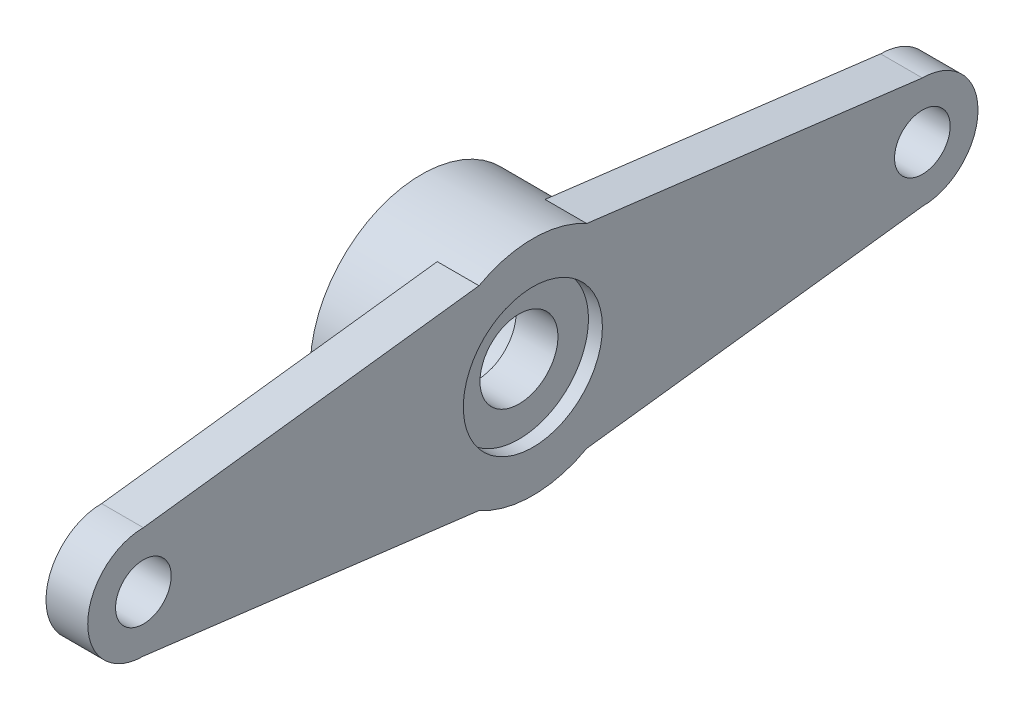
ISO-10303-21;
HEADER;
FILE_DESCRIPTION(('STEP AP214'),'2;1');
FILE_NAME('part.step','',(''),(''),'','','');
FILE_SCHEMA(('AUTOMOTIVE_DESIGN { 1 0 10303 214 1 1 1 1 }'));
ENDSEC;
DATA;
#1=APPLICATION_CONTEXT('core data for automotive mechanical design processes');
#2=APPLICATION_PROTOCOL_DEFINITION('international standard','automotive_design',2000,#1);
#3=PRODUCT_CONTEXT('',#1,'mechanical');
#4=PRODUCT('Part','Part','',(#3));
#5=PRODUCT_RELATED_PRODUCT_CATEGORY('part','',(#4));
#6=PRODUCT_DEFINITION_FORMATION('','',#4);
#7=PRODUCT_DEFINITION_CONTEXT('part definition',#1,'design');
#8=PRODUCT_DEFINITION('design','',#6,#7);
#9=PRODUCT_DEFINITION_SHAPE('','',#8);
#10=(LENGTH_UNIT() NAMED_UNIT(*) SI_UNIT(.MILLI.,.METRE.));
#11=(NAMED_UNIT(*) PLANE_ANGLE_UNIT() SI_UNIT($,.RADIAN.));
#12=(NAMED_UNIT(*) SI_UNIT($,.STERADIAN.) SOLID_ANGLE_UNIT());
#13=UNCERTAINTY_MEASURE_WITH_UNIT(LENGTH_MEASURE(1.E-05),#10,'distance_accuracy_value','');
#14=(GEOMETRIC_REPRESENTATION_CONTEXT(3) GLOBAL_UNCERTAINTY_ASSIGNED_CONTEXT((#13)) GLOBAL_UNIT_ASSIGNED_CONTEXT((#10,
#11,#12)) REPRESENTATION_CONTEXT('',''));
#15=CARTESIAN_POINT('',(0.,0.,0.));
#16=DIRECTION('',(0.,0.,1.));
#17=DIRECTION('',(1.,0.,0.));
#18=AXIS2_PLACEMENT_3D('',#15,#16,#17);
#19=CARTESIAN_POINT('',(3.5,0.,0.));
#20=DIRECTION('',(-1.,0.,0.));
#21=DIRECTION('',(0.,0.,1.));
#22=AXIS2_PLACEMENT_3D('',#19,#20,#21);
#23=CYLINDRICAL_SURFACE('',#22,2.5);
#24=CARTESIAN_POINT('',(3.5,0.,0.));
#25=DIRECTION('',(-1.,0.,0.));
#26=DIRECTION('',(0.,0.,1.));
#27=AXIS2_PLACEMENT_3D('',#24,#25,#26);
#28=CIRCLE('',#27,2.5);
#29=CARTESIAN_POINT('',(3.5,0.,2.5));
#30=VERTEX_POINT('',#29);
#31=EDGE_CURVE('E11',#30,#30,#28,.T.);
#32=ORIENTED_EDGE('',*,*,#31,.T.);
#33=EDGE_LOOP('',(#32));
#34=FACE_BOUND('',#33,.T.);
#35=CARTESIAN_POINT('',(2.,0.,0.));
#36=DIRECTION('',(-1.,0.,0.));
#37=DIRECTION('',(0.,0.,1.));
#38=AXIS2_PLACEMENT_3D('',#35,#36,#37);
#39=CIRCLE('',#38,2.5);
#40=CARTESIAN_POINT('',(2.,0.,2.5));
#41=VERTEX_POINT('',#40);
#42=EDGE_CURVE('E54',#41,#41,#39,.T.);
#43=ORIENTED_EDGE('',*,*,#42,.F.);
#44=EDGE_LOOP('',(#43));
#45=FACE_BOUND('',#44,.T.);
#46=ADVANCED_FACE('F41',(#34,#45),#23,.T.);
#47=CARTESIAN_POINT('',(3.5,0.,0.));
#48=DIRECTION('',(-1.,0.,0.));
#49=DIRECTION('',(0.,0.,1.));
#50=AXIS2_PLACEMENT_3D('',#47,#48,#49);
#51=CYLINDRICAL_SURFACE('',#50,1.40092198796597);
#52=CARTESIAN_POINT('',(3.5,0.,0.));
#53=DIRECTION('',(-1.,0.,0.));
#54=DIRECTION('',(0.,0.,1.));
#55=AXIS2_PLACEMENT_3D('',#52,#53,#54);
#56=CIRCLE('',#55,1.40092198796597);
#57=CARTESIAN_POINT('',(3.5,0.,1.40092198796597));
#58=VERTEX_POINT('',#57);
#59=EDGE_CURVE('E48',#58,#58,#56,.T.);
#60=ORIENTED_EDGE('',*,*,#59,.F.);
#61=EDGE_LOOP('',(#60));
#62=FACE_BOUND('',#61,.T.);
#63=CARTESIAN_POINT('',(2.,0.,0.));
#64=DIRECTION('',(-1.,0.,0.));
#65=DIRECTION('',(0.,0.,1.));
#66=AXIS2_PLACEMENT_3D('',#63,#64,#65);
#67=CIRCLE('',#66,1.40092198796597);
#68=CARTESIAN_POINT('',(2.,0.,1.40092198796597));
#69=VERTEX_POINT('',#68);
#70=EDGE_CURVE('E44',#69,#69,#67,.F.);
#71=ORIENTED_EDGE('',*,*,#70,.F.);
#72=EDGE_LOOP('',(#71));
#73=FACE_BOUND('',#72,.T.);
#74=ADVANCED_FACE('F63',(#62,#73),#51,.F.);
#75=CARTESIAN_POINT('',(3.5,0.,0.));
#76=DIRECTION('',(-1.,0.,0.));
#77=DIRECTION('',(0.,0.,1.));
#78=AXIS2_PLACEMENT_3D('',#75,#76,#77);
#79=PLANE('',#78);
#80=ORIENTED_EDGE('',*,*,#59,.T.);
#81=EDGE_LOOP('',(#80));
#82=FACE_BOUND('',#81,.T.);
#83=ORIENTED_EDGE('',*,*,#31,.F.);
#84=EDGE_LOOP('',(#83));
#85=FACE_BOUND('',#84,.T.);
#86=ADVANCED_FACE('F65',(#82,#85),#79,.F.);
#87=CARTESIAN_POINT('',(2.,0.,0.));
#88=DIRECTION('',(-1.,0.,0.));
#89=DIRECTION('',(0.,0.,1.));
#90=AXIS2_PLACEMENT_3D('',#87,#88,#89);
#91=PLANE('',#90);
#92=ORIENTED_EDGE('',*,*,#42,.T.);
#93=EDGE_LOOP('',(#92));
#94=FACE_BOUND('',#93,.T.);
#95=ORIENTED_EDGE('',*,*,#70,.T.);
#96=EDGE_LOOP('',(#95));
#97=FACE_BOUND('',#96,.T.);
#98=ADVANCED_FACE('F61',(#94,#97),#91,.T.);
#99=CLOSED_SHELL('',(#46,#74,#86,#98));
#100=MANIFOLD_SOLID_BREP('B2',#99);
#101=CARTESIAN_POINT('',(0.,0.,0.));
#102=DIRECTION('',(1.,0.,0.));
#103=DIRECTION('',(0.,0.,-1.));
#104=AXIS2_PLACEMENT_3D('',#101,#102,#103);
#105=PLANE('',#104);
#106=CARTESIAN_POINT('',(0.,0.,0.));
#107=DIRECTION('',(1.,0.,0.));
#108=DIRECTION('',(0.,0.,-1.));
#109=AXIS2_PLACEMENT_3D('',#106,#107,#108);
#110=CIRCLE('',#109,4.);
#111=CARTESIAN_POINT('',(0.,0.,-4.));
#112=VERTEX_POINT('',#111);
#113=EDGE_CURVE('E107',#112,#112,#110,.T.);
#114=ORIENTED_EDGE('',*,*,#113,.F.);
#115=EDGE_LOOP('',(#114));
#116=FACE_BOUND('',#115,.T.);
#117=CARTESIAN_POINT('',(0.,0.,0.));
#118=DIRECTION('',(1.,0.,0.));
#119=DIRECTION('',(0.,0.,-1.));
#120=AXIS2_PLACEMENT_3D('',#117,#118,#119);
#121=CIRCLE('',#120,2.5);
#122=CARTESIAN_POINT('',(0.,0.,-2.5));
#123=VERTEX_POINT('',#122);
#124=EDGE_CURVE('E189',#123,#123,#121,.T.);
#125=ORIENTED_EDGE('',*,*,#124,.T.);
#126=EDGE_LOOP('',(#125));
#127=FACE_BOUND('',#126,.T.);
#128=ADVANCED_FACE('F103',(#116,#127),#105,.F.);
#129=CARTESIAN_POINT('',(2.5,0.,0.));
#130=DIRECTION('',(-1.,0.,0.));
#131=DIRECTION('',(0.,0.,1.));
#132=AXIS2_PLACEMENT_3D('',#129,#130,#131);
#133=CYLINDRICAL_SURFACE('',#132,4.);
#134=CARTESIAN_POINT('',(2.5,0.,0.));
#135=DIRECTION('',(1.,0.,0.));
#136=DIRECTION('',(0.,0.,-1.));
#137=AXIS2_PLACEMENT_3D('',#134,#135,#136);
#138=CIRCLE('',#137,4.);
#139=CARTESIAN_POINT('',(2.5,3.5,1.93649167310372));
#140=VERTEX_POINT('',#139);
#141=CARTESIAN_POINT('',(2.5,-3.5,1.9364916731037));
#142=VERTEX_POINT('',#141);
#143=EDGE_CURVE('E39',#140,#142,#138,.T.);
#144=ORIENTED_EDGE('',*,*,#143,.F.);
#145=DIRECTION('',(-1.,0.,0.));
#146=VECTOR('',#145,1.);
#147=CARTESIAN_POINT('',(4.,3.5,1.93649167310371));
#148=LINE('',#147,#146);
#149=CARTESIAN_POINT('',(4.,3.5,1.93649167310371));
#150=VERTEX_POINT('',#149);
#151=EDGE_CURVE('E257',#150,#140,#148,.T.);
#152=ORIENTED_EDGE('',*,*,#151,.F.);
#153=CARTESIAN_POINT('',(4.,0.,0.));
#154=DIRECTION('',(1.,0.,0.));
#155=DIRECTION('',(0.,0.,-1.));
#156=AXIS2_PLACEMENT_3D('',#153,#154,#155);
#157=CIRCLE('',#156,4.);
#158=CARTESIAN_POINT('',(4.,3.5,-1.93649167310371));
#159=VERTEX_POINT('',#158);
#160=EDGE_CURVE('E232',#159,#150,#157,.T.);
#161=ORIENTED_EDGE('',*,*,#160,.F.);
#162=DIRECTION('',(-1.,0.,0.));
#163=VECTOR('',#162,1.);
#164=CARTESIAN_POINT('',(4.,3.5,-1.93649167310371));
#165=LINE('',#164,#163);
#166=CARTESIAN_POINT('',(2.5,3.5,-1.93649167310371));
#167=VERTEX_POINT('',#166);
#168=EDGE_CURVE('E260',#159,#167,#165,.T.);
#169=ORIENTED_EDGE('',*,*,#168,.T.);
#170=CARTESIAN_POINT('',(2.5,-3.5,-1.9364916731037));
#171=VERTEX_POINT('',#170);
#172=EDGE_CURVE('E112',#171,#167,#138,.T.);
#173=ORIENTED_EDGE('',*,*,#172,.F.);
#174=DIRECTION('',(-1.,0.,0.));
#175=VECTOR('',#174,1.);
#176=CARTESIAN_POINT('',(4.,-3.5,-1.9364916731037));
#177=LINE('',#176,#175);
#178=CARTESIAN_POINT('',(4.,-3.5,-1.9364916731037));
#179=VERTEX_POINT('',#178);
#180=EDGE_CURVE('E171',#179,#171,#177,.T.);
#181=ORIENTED_EDGE('',*,*,#180,.F.);
#182=CARTESIAN_POINT('',(4.,0.,0.));
#183=DIRECTION('',(1.,0.,0.));
#184=DIRECTION('',(0.,0.,-1.));
#185=AXIS2_PLACEMENT_3D('',#182,#183,#184);
#186=CIRCLE('',#185,4.);
#187=CARTESIAN_POINT('',(4.,-3.5,1.9364916731037));
#188=VERTEX_POINT('',#187);
#189=EDGE_CURVE('E177',#188,#179,#186,.T.);
#190=ORIENTED_EDGE('',*,*,#189,.F.);
#191=DIRECTION('',(-1.,0.,0.));
#192=VECTOR('',#191,1.);
#193=CARTESIAN_POINT('',(4.,-3.5,1.9364916731037));
#194=LINE('',#193,#192);
#195=EDGE_CURVE('E239',#188,#142,#194,.T.);
#196=ORIENTED_EDGE('',*,*,#195,.T.);
#197=EDGE_LOOP('',(#144,#152,#161,#169,#173,#181,#190,#196));
#198=FACE_BOUND('',#197,.T.);
#199=ORIENTED_EDGE('',*,*,#113,.T.);
#200=EDGE_LOOP('',(#199));
#201=FACE_BOUND('',#200,.T.);
#202=ADVANCED_FACE('F105',(#198,#201),#133,.T.);
#203=CARTESIAN_POINT('',(2.5,0.,0.));
#204=DIRECTION('',(-1.,0.,0.));
#205=DIRECTION('',(0.,0.,1.));
#206=AXIS2_PLACEMENT_3D('',#203,#204,#205);
#207=CYLINDRICAL_SURFACE('',#206,2.5);
#208=ORIENTED_EDGE('',*,*,#124,.F.);
#209=EDGE_LOOP('',(#208));
#210=FACE_BOUND('',#209,.T.);
#211=CARTESIAN_POINT('',(4.,0.,0.));
#212=DIRECTION('',(1.,0.,0.));
#213=DIRECTION('',(0.,0.,-1.));
#214=AXIS2_PLACEMENT_3D('',#211,#212,#213);
#215=CIRCLE('',#214,2.5);
#216=CARTESIAN_POINT('',(4.,0.,-2.5));
#217=VERTEX_POINT('',#216);
#218=EDGE_CURVE('E213',#217,#217,#215,.T.);
#219=ORIENTED_EDGE('',*,*,#218,.T.);
#220=EDGE_LOOP('',(#219));
#221=FACE_BOUND('',#220,.T.);
#222=ADVANCED_FACE('F206',(#210,#221),#207,.F.);
#223=CARTESIAN_POINT('',(2.5,0.,0.));
#224=DIRECTION('',(1.,0.,0.));
#225=DIRECTION('',(0.,0.,-1.));
#226=AXIS2_PLACEMENT_3D('',#223,#224,#225);
#227=PLANE('',#226);
#228=CARTESIAN_POINT('',(2.5,0.,14.));
#229=DIRECTION('',(1.,0.,0.));
#230=DIRECTION('',(0.,0.,-1.));
#231=AXIS2_PLACEMENT_3D('',#228,#229,#230);
#232=CIRCLE('',#231,1.);
#233=CARTESIAN_POINT('',(2.5,0.,13.));
#234=VERTEX_POINT('',#233);
#235=EDGE_CURVE('E222',#234,#234,#232,.T.);
#236=ORIENTED_EDGE('',*,*,#235,.T.);
#237=EDGE_LOOP('',(#236));
#238=FACE_BOUND('',#237,.T.);
#239=DIRECTION('',(0.,-0.123391721734239,0.992358041740712));
#240=VECTOR('',#239,1.);
#241=CARTESIAN_POINT('',(2.5,2.,14.));
#242=LINE('',#241,#240);
#243=CARTESIAN_POINT('',(2.5,2.,14.));
#244=VERTEX_POINT('',#243);
#245=EDGE_CURVE('E245',#140,#244,#242,.T.);
#246=ORIENTED_EDGE('',*,*,#245,.F.);
#247=ORIENTED_EDGE('',*,*,#143,.T.);
#248=DIRECTION('',(0.,-0.12339172173424,-0.992358041740712));
#249=VECTOR('',#248,1.);
#250=CARTESIAN_POINT('',(2.5,-3.5,1.9364916731037));
#251=LINE('',#250,#249);
#252=CARTESIAN_POINT('',(2.5,-2.,14.));
#253=VERTEX_POINT('',#252);
#254=EDGE_CURVE('E186',#253,#142,#251,.T.);
#255=ORIENTED_EDGE('',*,*,#254,.F.);
#256=CARTESIAN_POINT('',(2.5,0.,14.));
#257=DIRECTION('',(1.,0.,0.));
#258=DIRECTION('',(0.,0.,-1.));
#259=AXIS2_PLACEMENT_3D('',#256,#257,#258);
#260=CIRCLE('',#259,2.);
#261=EDGE_CURVE('E247',#244,#253,#260,.T.);
#262=ORIENTED_EDGE('',*,*,#261,.F.);
#263=EDGE_LOOP('',(#246,#247,#255,#262));
#264=FACE_BOUND('',#263,.T.);
#265=ADVANCED_FACE('F209',(#238,#264),#227,.F.);
#266=CARTESIAN_POINT('',(2.5,0.,-14.));
#267=DIRECTION('',(1.,0.,0.));
#268=DIRECTION('',(0.,0.,-1.));
#269=AXIS2_PLACEMENT_3D('',#266,#267,#268);
#270=CIRCLE('',#269,1.);
#271=CARTESIAN_POINT('',(2.5,0.,-15.));
#272=VERTEX_POINT('',#271);
#273=EDGE_CURVE('E215',#272,#272,#270,.T.);
#274=ORIENTED_EDGE('',*,*,#273,.T.);
#275=EDGE_LOOP('',(#274));
#276=FACE_BOUND('',#275,.T.);
#277=DIRECTION('',(0.,0.12339172173424,-0.992358041740712));
#278=VECTOR('',#277,1.);
#279=CARTESIAN_POINT('',(2.5,-2.,-14.));
#280=LINE('',#279,#278);
#281=CARTESIAN_POINT('',(2.5,-2.,-14.));
#282=VERTEX_POINT('',#281);
#283=EDGE_CURVE('E227',#171,#282,#280,.T.);
#284=ORIENTED_EDGE('',*,*,#283,.F.);
#285=ORIENTED_EDGE('',*,*,#172,.T.);
#286=DIRECTION('',(0.,0.123391721734239,0.992358041740712));
#287=VECTOR('',#286,1.);
#288=CARTESIAN_POINT('',(2.5,2.,-14.));
#289=LINE('',#288,#287);
#290=CARTESIAN_POINT('',(2.5,2.,-14.));
#291=VERTEX_POINT('',#290);
#292=EDGE_CURVE('E243',#291,#167,#289,.T.);
#293=ORIENTED_EDGE('',*,*,#292,.F.);
#294=CARTESIAN_POINT('',(2.5,0.,-14.));
#295=DIRECTION('',(1.,0.,0.));
#296=DIRECTION('',(0.,0.,-1.));
#297=AXIS2_PLACEMENT_3D('',#294,#295,#296);
#298=CIRCLE('',#297,2.);
#299=EDGE_CURVE('E241',#282,#291,#298,.T.);
#300=ORIENTED_EDGE('',*,*,#299,.F.);
#301=EDGE_LOOP('',(#284,#285,#293,#300));
#302=FACE_BOUND('',#301,.T.);
#303=ADVANCED_FACE('F269',(#276,#302),#227,.F.);
#304=CARTESIAN_POINT('',(4.,0.,0.));
#305=DIRECTION('',(1.,0.,0.));
#306=DIRECTION('',(0.,0.,-1.));
#307=AXIS2_PLACEMENT_3D('',#304,#305,#306);
#308=PLANE('',#307);
#309=ORIENTED_EDGE('',*,*,#218,.F.);
#310=EDGE_LOOP('',(#309));
#311=FACE_BOUND('',#310,.T.);
#312=ORIENTED_EDGE('',*,*,#189,.T.);
#313=DIRECTION('',(0.,0.12339172173424,-0.992358041740712));
#314=VECTOR('',#313,1.);
#315=CARTESIAN_POINT('',(4.,-2.,-14.));
#316=LINE('',#315,#314);
#317=CARTESIAN_POINT('',(4.,-2.,-14.));
#318=VERTEX_POINT('',#317);
#319=EDGE_CURVE('E168',#179,#318,#316,.T.);
#320=ORIENTED_EDGE('',*,*,#319,.T.);
#321=CARTESIAN_POINT('',(4.,0.,-14.));
#322=DIRECTION('',(1.,0.,0.));
#323=DIRECTION('',(0.,0.,-1.));
#324=AXIS2_PLACEMENT_3D('',#321,#322,#323);
#325=CIRCLE('',#324,2.);
#326=CARTESIAN_POINT('',(4.,2.,-14.));
#327=VERTEX_POINT('',#326);
#328=EDGE_CURVE('E176',#318,#327,#325,.T.);
#329=ORIENTED_EDGE('',*,*,#328,.T.);
#330=DIRECTION('',(0.,0.123391721734239,0.992358041740712));
#331=VECTOR('',#330,1.);
#332=CARTESIAN_POINT('',(4.,2.,-14.));
#333=LINE('',#332,#331);
#334=EDGE_CURVE('E230',#327,#159,#333,.T.);
#335=ORIENTED_EDGE('',*,*,#334,.T.);
#336=ORIENTED_EDGE('',*,*,#160,.T.);
#337=DIRECTION('',(0.,-0.123391721734239,0.992358041740712));
#338=VECTOR('',#337,1.);
#339=CARTESIAN_POINT('',(4.,2.,14.));
#340=LINE('',#339,#338);
#341=CARTESIAN_POINT('',(4.,2.,14.));
#342=VERTEX_POINT('',#341);
#343=EDGE_CURVE('E234',#150,#342,#340,.T.);
#344=ORIENTED_EDGE('',*,*,#343,.T.);
#345=CARTESIAN_POINT('',(4.,0.,14.));
#346=DIRECTION('',(1.,0.,0.));
#347=DIRECTION('',(0.,0.,-1.));
#348=AXIS2_PLACEMENT_3D('',#345,#346,#347);
#349=CIRCLE('',#348,2.);
#350=CARTESIAN_POINT('',(4.,-2.,14.));
#351=VERTEX_POINT('',#350);
#352=EDGE_CURVE('E236',#342,#351,#349,.T.);
#353=ORIENTED_EDGE('',*,*,#352,.T.);
#354=DIRECTION('',(0.,-0.12339172173424,-0.992358041740712));
#355=VECTOR('',#354,1.);
#356=CARTESIAN_POINT('',(4.,-3.5,1.9364916731037));
#357=LINE('',#356,#355);
#358=EDGE_CURVE('E183',#351,#188,#357,.T.);
#359=ORIENTED_EDGE('',*,*,#358,.T.);
#360=EDGE_LOOP('',(#312,#320,#329,#335,#336,#344,#353,#359));
#361=FACE_BOUND('',#360,.T.);
#362=CARTESIAN_POINT('',(4.,0.,-14.));
#363=DIRECTION('',(1.,0.,0.));
#364=DIRECTION('',(0.,0.,-1.));
#365=AXIS2_PLACEMENT_3D('',#362,#363,#364);
#366=CIRCLE('',#365,1.);
#367=CARTESIAN_POINT('',(4.,0.,-15.));
#368=VERTEX_POINT('',#367);
#369=EDGE_CURVE('E219',#368,#368,#366,.T.);
#370=ORIENTED_EDGE('',*,*,#369,.F.);
#371=EDGE_LOOP('',(#370));
#372=FACE_BOUND('',#371,.T.);
#373=CARTESIAN_POINT('',(4.,0.,14.));
#374=DIRECTION('',(1.,0.,0.));
#375=DIRECTION('',(0.,0.,-1.));
#376=AXIS2_PLACEMENT_3D('',#373,#374,#375);
#377=CIRCLE('',#376,1.);
#378=CARTESIAN_POINT('',(4.,0.,13.));
#379=VERTEX_POINT('',#378);
#380=EDGE_CURVE('E216',#379,#379,#377,.T.);
#381=ORIENTED_EDGE('',*,*,#380,.F.);
#382=EDGE_LOOP('',(#381));
#383=FACE_BOUND('',#382,.T.);
#384=ADVANCED_FACE('F180',(#311,#361,#372,#383),#308,.T.);
#385=CARTESIAN_POINT('',(4.,-2.,-14.));
#386=DIRECTION('',(0.,0.992358041740712,0.12339172173424));
#387=DIRECTION('',(0.,-0.12339172173424,0.992358041740712));
#388=AXIS2_PLACEMENT_3D('',#385,#386,#387);
#389=PLANE('',#388);
#390=ORIENTED_EDGE('',*,*,#283,.T.);
#391=DIRECTION('',(-1.,0.,0.));
#392=VECTOR('',#391,1.);
#393=CARTESIAN_POINT('',(4.,-2.,-14.));
#394=LINE('',#393,#392);
#395=EDGE_CURVE('E173',#318,#282,#394,.T.);
#396=ORIENTED_EDGE('',*,*,#395,.F.);
#397=ORIENTED_EDGE('',*,*,#319,.F.);
#398=ORIENTED_EDGE('',*,*,#180,.T.);
#399=EDGE_LOOP('',(#390,#396,#397,#398));
#400=FACE_BOUND('',#399,.T.);
#401=ADVANCED_FACE('F170',(#400),#389,.F.);
#402=CARTESIAN_POINT('',(4.,0.,-14.));
#403=DIRECTION('',(-1.,0.,0.));
#404=DIRECTION('',(0.,0.,1.));
#405=AXIS2_PLACEMENT_3D('',#402,#403,#404);
#406=CYLINDRICAL_SURFACE('',#405,2.);
#407=ORIENTED_EDGE('',*,*,#299,.T.);
#408=DIRECTION('',(-1.,0.,0.));
#409=VECTOR('',#408,1.);
#410=CARTESIAN_POINT('',(4.,2.,-14.));
#411=LINE('',#410,#409);
#412=EDGE_CURVE('E193',#327,#291,#411,.T.);
#413=ORIENTED_EDGE('',*,*,#412,.F.);
#414=ORIENTED_EDGE('',*,*,#328,.F.);
#415=ORIENTED_EDGE('',*,*,#395,.T.);
#416=EDGE_LOOP('',(#407,#413,#414,#415));
#417=FACE_BOUND('',#416,.T.);
#418=ADVANCED_FACE('F270',(#417),#406,.T.);
#419=CARTESIAN_POINT('',(4.,2.,-14.));
#420=DIRECTION('',(0.,-0.992358041740712,0.123391721734239));
#421=DIRECTION('',(0.,-0.123391721734239,-0.992358041740712));
#422=AXIS2_PLACEMENT_3D('',#419,#420,#421);
#423=PLANE('',#422);
#424=ORIENTED_EDGE('',*,*,#292,.T.);
#425=ORIENTED_EDGE('',*,*,#168,.F.);
#426=ORIENTED_EDGE('',*,*,#334,.F.);
#427=ORIENTED_EDGE('',*,*,#412,.T.);
#428=EDGE_LOOP('',(#424,#425,#426,#427));
#429=FACE_BOUND('',#428,.T.);
#430=ADVANCED_FACE('F265',(#429),#423,.F.);
#431=CARTESIAN_POINT('',(4.,2.,14.));
#432=DIRECTION('',(0.,-0.992358041740712,-0.123391721734239));
#433=DIRECTION('',(0.,0.123391721734239,-0.992358041740712));
#434=AXIS2_PLACEMENT_3D('',#431,#432,#433);
#435=PLANE('',#434);
#436=ORIENTED_EDGE('',*,*,#245,.T.);
#437=DIRECTION('',(-1.,0.,0.));
#438=VECTOR('',#437,1.);
#439=CARTESIAN_POINT('',(4.,2.,14.));
#440=LINE('',#439,#438);
#441=EDGE_CURVE('E254',#342,#244,#440,.T.);
#442=ORIENTED_EDGE('',*,*,#441,.F.);
#443=ORIENTED_EDGE('',*,*,#343,.F.);
#444=ORIENTED_EDGE('',*,*,#151,.T.);
#445=EDGE_LOOP('',(#436,#442,#443,#444));
#446=FACE_BOUND('',#445,.T.);
#447=ADVANCED_FACE('F276',(#446),#435,.F.);
#448=CARTESIAN_POINT('',(4.,0.,14.));
#449=DIRECTION('',(-1.,0.,0.));
#450=DIRECTION('',(0.,0.,1.));
#451=AXIS2_PLACEMENT_3D('',#448,#449,#450);
#452=CYLINDRICAL_SURFACE('',#451,2.);
#453=ORIENTED_EDGE('',*,*,#261,.T.);
#454=DIRECTION('',(-1.,0.,0.));
#455=VECTOR('',#454,1.);
#456=CARTESIAN_POINT('',(4.,-2.,14.));
#457=LINE('',#456,#455);
#458=EDGE_CURVE('E251',#351,#253,#457,.T.);
#459=ORIENTED_EDGE('',*,*,#458,.F.);
#460=ORIENTED_EDGE('',*,*,#352,.F.);
#461=ORIENTED_EDGE('',*,*,#441,.T.);
#462=EDGE_LOOP('',(#453,#459,#460,#461));
#463=FACE_BOUND('',#462,.T.);
#464=ADVANCED_FACE('F280',(#463),#452,.T.);
#465=CARTESIAN_POINT('',(4.,-3.5,1.9364916731037));
#466=DIRECTION('',(0.,0.992358041740712,-0.12339172173424));
#467=DIRECTION('',(0.,0.12339172173424,0.992358041740712));
#468=AXIS2_PLACEMENT_3D('',#465,#466,#467);
#469=PLANE('',#468);
#470=ORIENTED_EDGE('',*,*,#254,.T.);
#471=ORIENTED_EDGE('',*,*,#195,.F.);
#472=ORIENTED_EDGE('',*,*,#358,.F.);
#473=ORIENTED_EDGE('',*,*,#458,.T.);
#474=EDGE_LOOP('',(#470,#471,#472,#473));
#475=FACE_BOUND('',#474,.T.);
#476=ADVANCED_FACE('F283',(#475),#469,.F.);
#477=CARTESIAN_POINT('',(4.,0.,-14.));
#478=DIRECTION('',(-1.,0.,0.));
#479=DIRECTION('',(0.,0.,1.));
#480=AXIS2_PLACEMENT_3D('',#477,#478,#479);
#481=CYLINDRICAL_SURFACE('',#480,1.);
#482=ORIENTED_EDGE('',*,*,#369,.T.);
#483=EDGE_LOOP('',(#482));
#484=FACE_BOUND('',#483,.T.);
#485=ORIENTED_EDGE('',*,*,#273,.F.);
#486=EDGE_LOOP('',(#485));
#487=FACE_BOUND('',#486,.T.);
#488=ADVANCED_FACE('F297',(#484,#487),#481,.F.);
#489=CARTESIAN_POINT('',(4.,0.,14.));
#490=DIRECTION('',(-1.,0.,0.));
#491=DIRECTION('',(0.,0.,1.));
#492=AXIS2_PLACEMENT_3D('',#489,#490,#491);
#493=CYLINDRICAL_SURFACE('',#492,1.);
#494=ORIENTED_EDGE('',*,*,#380,.T.);
#495=EDGE_LOOP('',(#494));
#496=FACE_BOUND('',#495,.T.);
#497=ORIENTED_EDGE('',*,*,#235,.F.);
#498=EDGE_LOOP('',(#497));
#499=FACE_BOUND('',#498,.T.);
#500=ADVANCED_FACE('F389',(#496,#499),#493,.F.);
#501=CLOSED_SHELL('',(#128,#202,#222,#265,#303,#384,#401,#418,#430,#447,#464,#476,#488,#500));
#502=MANIFOLD_SOLID_BREP('B6',#501);
#503=ADVANCED_BREP_SHAPE_REPRESENTATION('',(#18,#100,#502),#14);
#504=SHAPE_DEFINITION_REPRESENTATION(#9,#503);
ENDSEC;
END-ISO-10303-21;
